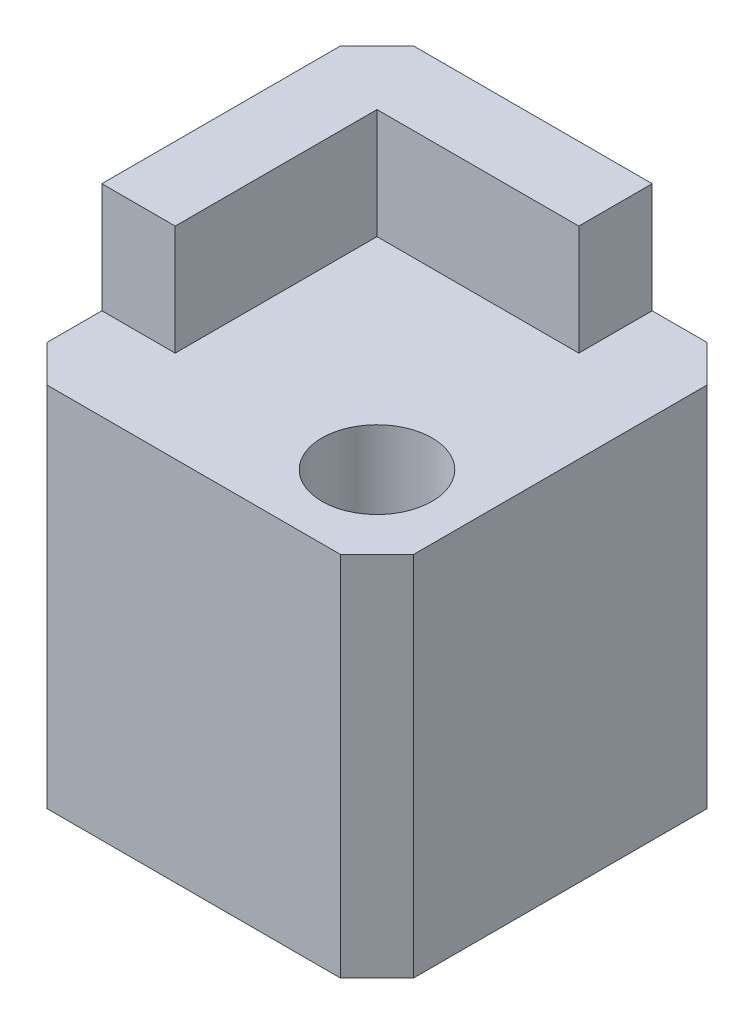
ISO-10303-21;
HEADER;
FILE_DESCRIPTION(('STEP AP214'),'2;1');
FILE_NAME('part.step','',(''),(''),'','','');
FILE_SCHEMA(('AUTOMOTIVE_DESIGN { 1 0 10303 214 1 1 1 1 }'));
ENDSEC;
DATA;
#1=APPLICATION_CONTEXT('core data for automotive mechanical design processes');
#2=APPLICATION_PROTOCOL_DEFINITION('international standard','automotive_design',2000,#1);
#3=PRODUCT_CONTEXT('',#1,'mechanical');
#4=PRODUCT('Part','Part','',(#3));
#5=PRODUCT_RELATED_PRODUCT_CATEGORY('part','',(#4));
#6=PRODUCT_DEFINITION_FORMATION('','',#4);
#7=PRODUCT_DEFINITION_CONTEXT('part definition',#1,'design');
#8=PRODUCT_DEFINITION('design','',#6,#7);
#9=PRODUCT_DEFINITION_SHAPE('','',#8);
#10=(LENGTH_UNIT() NAMED_UNIT(*) SI_UNIT(.MILLI.,.METRE.));
#11=(NAMED_UNIT(*) PLANE_ANGLE_UNIT() SI_UNIT($,.RADIAN.));
#12=(NAMED_UNIT(*) SI_UNIT($,.STERADIAN.) SOLID_ANGLE_UNIT());
#13=UNCERTAINTY_MEASURE_WITH_UNIT(LENGTH_MEASURE(1.E-05),#10,'distance_accuracy_value','');
#14=(GEOMETRIC_REPRESENTATION_CONTEXT(3) GLOBAL_UNCERTAINTY_ASSIGNED_CONTEXT((#13)) GLOBAL_UNIT_ASSIGNED_CONTEXT((#10,
#11,#12)) REPRESENTATION_CONTEXT('',''));
#15=CARTESIAN_POINT('',(0.,0.,0.));
#16=DIRECTION('',(0.,0.,1.));
#17=DIRECTION('',(1.,0.,0.));
#18=AXIS2_PLACEMENT_3D('',#15,#16,#17);
#19=CARTESIAN_POINT('',(0.,0.,0.));
#20=DIRECTION('',(0.,1.,0.));
#21=DIRECTION('',(0.,0.,1.));
#22=AXIS2_PLACEMENT_3D('',#19,#20,#21);
#23=PLANE('',#22);
#24=CARTESIAN_POINT('',(0.,0.,0.));
#25=DIRECTION('',(0.,1.,0.));
#26=DIRECTION('',(0.,0.,1.));
#27=AXIS2_PLACEMENT_3D('',#24,#25,#26);
#28=CIRCLE('',#27,1.5);
#29=CARTESIAN_POINT('',(0.,0.,1.5));
#30=VERTEX_POINT('',#29);
#31=EDGE_CURVE('E190',#30,#30,#28,.T.);
#32=ORIENTED_EDGE('',*,*,#31,.F.);
#33=EDGE_LOOP('',(#32));
#34=FACE_BOUND('',#33,.T.);
#35=DIRECTION('',(0.,0.,1.));
#36=VECTOR('',#35,1.);
#37=CARTESIAN_POINT('',(2.5,0.,-7.5));
#38=LINE('',#37,#36);
#39=CARTESIAN_POINT('',(2.5,0.,-6.5));
#40=VERTEX_POINT('',#39);
#41=CARTESIAN_POINT('',(2.5,0.,1.49999999999999));
#42=VERTEX_POINT('',#41);
#43=EDGE_CURVE('E250',#40,#42,#38,.T.);
#44=ORIENTED_EDGE('',*,*,#43,.F.);
#45=DIRECTION('',(0.707106781186549,0.,0.707106781186546));
#46=VECTOR('',#45,1.);
#47=CARTESIAN_POINT('',(4.5,0.,-4.50000000000001));
#48=LINE('',#47,#46);
#49=CARTESIAN_POINT('',(1.49999999999999,0.,-7.5));
#50=VERTEX_POINT('',#49);
#51=EDGE_CURVE('E293',#40,#50,#48,.F.);
#52=ORIENTED_EDGE('',*,*,#51,.T.);
#53=DIRECTION('',(1.,0.,0.));
#54=VECTOR('',#53,1.);
#55=CARTESIAN_POINT('',(-7.5,0.,-7.5));
#56=LINE('',#55,#54);
#57=CARTESIAN_POINT('',(0.,0.,-7.5));
#58=VERTEX_POINT('',#57);
#59=EDGE_CURVE('E232',#58,#50,#56,.T.);
#60=ORIENTED_EDGE('',*,*,#59,.F.);
#61=DIRECTION('',(0.,0.,1.));
#62=VECTOR('',#61,1.);
#63=CARTESIAN_POINT('',(0.,0.,0.));
#64=LINE('',#63,#62);
#65=CARTESIAN_POINT('',(0.,0.,-5.5));
#66=VERTEX_POINT('',#65);
#67=EDGE_CURVE('E170',#58,#66,#64,.T.);
#68=ORIENTED_EDGE('',*,*,#67,.T.);
#69=DIRECTION('',(-1.,0.,0.));
#70=VECTOR('',#69,1.);
#71=CARTESIAN_POINT('',(0.,0.,-5.5));
#72=LINE('',#71,#70);
#73=CARTESIAN_POINT('',(-5.5,0.,-5.5));
#74=VERTEX_POINT('',#73);
#75=EDGE_CURVE('E181',#66,#74,#72,.T.);
#76=ORIENTED_EDGE('',*,*,#75,.T.);
#77=DIRECTION('',(0.,0.,1.));
#78=VECTOR('',#77,1.);
#79=CARTESIAN_POINT('',(-5.5,0.,0.));
#80=LINE('',#79,#78);
#81=CARTESIAN_POINT('',(-5.5,0.,0.));
#82=VERTEX_POINT('',#81);
#83=EDGE_CURVE('E187',#74,#82,#80,.T.);
#84=ORIENTED_EDGE('',*,*,#83,.T.);
#85=DIRECTION('',(-1.,0.,0.));
#86=VECTOR('',#85,1.);
#87=CARTESIAN_POINT('',(0.,0.,0.));
#88=LINE('',#87,#86);
#89=CARTESIAN_POINT('',(-7.5,0.,0.));
#90=VERTEX_POINT('',#89);
#91=EDGE_CURVE('E209',#82,#90,#88,.T.);
#92=ORIENTED_EDGE('',*,*,#91,.T.);
#93=DIRECTION('',(0.,0.,1.));
#94=VECTOR('',#93,1.);
#95=CARTESIAN_POINT('',(-7.5,0.,-7.5));
#96=LINE('',#95,#94);
#97=CARTESIAN_POINT('',(-7.5,0.,1.5));
#98=VERTEX_POINT('',#97);
#99=EDGE_CURVE('E173',#90,#98,#96,.T.);
#100=ORIENTED_EDGE('',*,*,#99,.T.);
#101=DIRECTION('',(-0.707106781186549,0.,-0.707106781186546));
#102=VECTOR('',#101,1.);
#103=CARTESIAN_POINT('',(-4.49999999999998,0.,4.5));
#104=LINE('',#103,#102);
#105=CARTESIAN_POINT('',(-6.5,0.,2.5));
#106=VERTEX_POINT('',#105);
#107=EDGE_CURVE('E77',#98,#106,#104,.F.);
#108=ORIENTED_EDGE('',*,*,#107,.T.);
#109=DIRECTION('',(1.,0.,0.));
#110=VECTOR('',#109,1.);
#111=CARTESIAN_POINT('',(-7.5,0.,2.5));
#112=LINE('',#111,#110);
#113=CARTESIAN_POINT('',(1.5,0.,2.5));
#114=VERTEX_POINT('',#113);
#115=EDGE_CURVE('E247',#106,#114,#112,.T.);
#116=ORIENTED_EDGE('',*,*,#115,.T.);
#117=DIRECTION('',(0.707106781186546,0.,-0.707106781186549));
#118=VECTOR('',#117,1.);
#119=CARTESIAN_POINT('',(2.,0.,1.99999999999999));
#120=LINE('',#119,#118);
#121=EDGE_CURVE('E69',#114,#42,#120,.T.);
#122=ORIENTED_EDGE('',*,*,#121,.T.);
#123=EDGE_LOOP('',(#44,#52,#60,#68,#76,#84,#92,#100,#108,#116,#122));
#124=FACE_BOUND('',#123,.T.);
#125=ADVANCED_FACE('F52',(#34,#124),#23,.T.);
#126=CARTESIAN_POINT('',(-7.5,-10.,-7.5));
#127=DIRECTION('',(-1.,0.,0.));
#128=DIRECTION('',(0.,0.,1.));
#129=AXIS2_PLACEMENT_3D('',#126,#127,#128);
#130=PLANE('',#129);
#131=DIRECTION('',(0.,0.,-1.));
#132=VECTOR('',#131,1.);
#133=CARTESIAN_POINT('',(-7.5,3.,0.));
#134=LINE('',#133,#132);
#135=CARTESIAN_POINT('',(-7.5,3.,0.));
#136=VERTEX_POINT('',#135);
#137=CARTESIAN_POINT('',(-7.5,3.,-6.5));
#138=VERTEX_POINT('',#137);
#139=EDGE_CURVE('E162',#136,#138,#134,.T.);
#140=ORIENTED_EDGE('',*,*,#139,.T.);
#141=DIRECTION('',(0.,-1.,0.));
#142=VECTOR('',#141,1.);
#143=CARTESIAN_POINT('',(-7.5,-10.,-6.5));
#144=LINE('',#143,#142);
#145=CARTESIAN_POINT('',(-7.5,-10.,-6.5));
#146=VERTEX_POINT('',#145);
#147=EDGE_CURVE('E267',#138,#146,#144,.T.);
#148=ORIENTED_EDGE('',*,*,#147,.T.);
#149=DIRECTION('',(0.,0.,1.));
#150=VECTOR('',#149,1.);
#151=CARTESIAN_POINT('',(-7.5,-10.,-7.5));
#152=LINE('',#151,#150);
#153=CARTESIAN_POINT('',(-7.5,-10.,1.5));
#154=VERTEX_POINT('',#153);
#155=EDGE_CURVE('E227',#146,#154,#152,.T.);
#156=ORIENTED_EDGE('',*,*,#155,.T.);
#157=DIRECTION('',(0.,1.,0.));
#158=VECTOR('',#157,1.);
#159=CARTESIAN_POINT('',(-7.5,-10.,1.5));
#160=LINE('',#159,#158);
#161=EDGE_CURVE('E263',#154,#98,#160,.T.);
#162=ORIENTED_EDGE('',*,*,#161,.T.);
#163=ORIENTED_EDGE('',*,*,#99,.F.);
#164=DIRECTION('',(0.,-1.,0.));
#165=VECTOR('',#164,1.);
#166=CARTESIAN_POINT('',(-7.5,3.,0.));
#167=LINE('',#166,#165);
#168=EDGE_CURVE('E174',#136,#90,#167,.T.);
#169=ORIENTED_EDGE('',*,*,#168,.F.);
#170=EDGE_LOOP('',(#140,#148,#156,#162,#163,#169));
#171=FACE_BOUND('',#170,.T.);
#172=ADVANCED_FACE('F323',(#171),#130,.T.);
#173=CARTESIAN_POINT('',(-7.5,-10.,-7.5));
#174=DIRECTION('',(0.,0.,1.));
#175=DIRECTION('',(1.,0.,0.));
#176=AXIS2_PLACEMENT_3D('',#173,#174,#175);
#177=PLANE('',#176);
#178=DIRECTION('',(1.,0.,0.));
#179=VECTOR('',#178,1.);
#180=CARTESIAN_POINT('',(-7.5,-10.,-7.5));
#181=LINE('',#180,#179);
#182=CARTESIAN_POINT('',(-6.5,-10.,-7.5));
#183=VERTEX_POINT('',#182);
#184=CARTESIAN_POINT('',(1.49999999999999,-10.,-7.5));
#185=VERTEX_POINT('',#184);
#186=EDGE_CURVE('E240',#183,#185,#181,.T.);
#187=ORIENTED_EDGE('',*,*,#186,.F.);
#188=DIRECTION('',(0.,1.,0.));
#189=VECTOR('',#188,1.);
#190=CARTESIAN_POINT('',(-6.5,3.,-7.5));
#191=LINE('',#190,#189);
#192=CARTESIAN_POINT('',(-6.5,3.,-7.5));
#193=VERTEX_POINT('',#192);
#194=EDGE_CURVE('E158',#183,#193,#191,.T.);
#195=ORIENTED_EDGE('',*,*,#194,.T.);
#196=DIRECTION('',(1.,0.,0.));
#197=VECTOR('',#196,1.);
#198=CARTESIAN_POINT('',(0.,3.,-7.5));
#199=LINE('',#198,#197);
#200=CARTESIAN_POINT('',(0.,3.,-7.5));
#201=VERTEX_POINT('',#200);
#202=EDGE_CURVE('E150',#193,#201,#199,.T.);
#203=ORIENTED_EDGE('',*,*,#202,.T.);
#204=DIRECTION('',(0.,-1.,0.));
#205=VECTOR('',#204,1.);
#206=CARTESIAN_POINT('',(0.,3.,-7.5));
#207=LINE('',#206,#205);
#208=EDGE_CURVE('E155',#201,#58,#207,.T.);
#209=ORIENTED_EDGE('',*,*,#208,.T.);
#210=ORIENTED_EDGE('',*,*,#59,.T.);
#211=DIRECTION('',(0.,-1.,0.));
#212=VECTOR('',#211,1.);
#213=CARTESIAN_POINT('',(1.49999999999999,-10.,-7.5));
#214=LINE('',#213,#212);
#215=EDGE_CURVE('E244',#50,#185,#214,.T.);
#216=ORIENTED_EDGE('',*,*,#215,.T.);
#217=EDGE_LOOP('',(#187,#195,#203,#209,#210,#216));
#218=FACE_BOUND('',#217,.T.);
#219=ADVANCED_FACE('F153',(#218),#177,.F.);
#220=CARTESIAN_POINT('',(2.5,-10.,-7.5));
#221=DIRECTION('',(-1.,0.,0.));
#222=DIRECTION('',(0.,0.,1.));
#223=AXIS2_PLACEMENT_3D('',#220,#221,#222);
#224=PLANE('',#223);
#225=DIRECTION('',(0.,0.,1.));
#226=VECTOR('',#225,1.);
#227=CARTESIAN_POINT('',(2.5,-10.,-7.5));
#228=LINE('',#227,#226);
#229=CARTESIAN_POINT('',(2.5,-10.,-6.5));
#230=VERTEX_POINT('',#229);
#231=CARTESIAN_POINT('',(2.5,-10.,1.49999999999999));
#232=VERTEX_POINT('',#231);
#233=EDGE_CURVE('E236',#230,#232,#228,.T.);
#234=ORIENTED_EDGE('',*,*,#233,.F.);
#235=DIRECTION('',(0.,1.,0.));
#236=VECTOR('',#235,1.);
#237=CARTESIAN_POINT('',(2.5,-10.,-6.5));
#238=LINE('',#237,#236);
#239=EDGE_CURVE('E285',#230,#40,#238,.T.);
#240=ORIENTED_EDGE('',*,*,#239,.T.);
#241=ORIENTED_EDGE('',*,*,#43,.T.);
#242=DIRECTION('',(0.,-1.,0.));
#243=VECTOR('',#242,1.);
#244=CARTESIAN_POINT('',(2.5,-10.,1.49999999999999));
#245=LINE('',#244,#243);
#246=EDGE_CURVE('E282',#42,#232,#245,.T.);
#247=ORIENTED_EDGE('',*,*,#246,.T.);
#248=EDGE_LOOP('',(#234,#240,#241,#247));
#249=FACE_BOUND('',#248,.T.);
#250=ADVANCED_FACE('F306',(#249),#224,.F.);
#251=CARTESIAN_POINT('',(-7.5,-10.,2.5));
#252=DIRECTION('',(0.,0.,1.));
#253=DIRECTION('',(1.,0.,0.));
#254=AXIS2_PLACEMENT_3D('',#251,#252,#253);
#255=PLANE('',#254);
#256=ORIENTED_EDGE('',*,*,#115,.F.);
#257=DIRECTION('',(0.,-1.,0.));
#258=VECTOR('',#257,1.);
#259=CARTESIAN_POINT('',(-6.5,-10.,2.5));
#260=LINE('',#259,#258);
#261=CARTESIAN_POINT('',(-6.5,-10.,2.5));
#262=VERTEX_POINT('',#261);
#263=EDGE_CURVE('E11',#106,#262,#260,.T.);
#264=ORIENTED_EDGE('',*,*,#263,.T.);
#265=DIRECTION('',(1.,0.,0.));
#266=VECTOR('',#265,1.);
#267=CARTESIAN_POINT('',(-7.5,-10.,2.5));
#268=LINE('',#267,#266);
#269=CARTESIAN_POINT('',(1.5,-10.,2.5));
#270=VERTEX_POINT('',#269);
#271=EDGE_CURVE('E231',#262,#270,#268,.T.);
#272=ORIENTED_EDGE('',*,*,#271,.T.);
#273=DIRECTION('',(0.,1.,0.));
#274=VECTOR('',#273,1.);
#275=CARTESIAN_POINT('',(1.5,0.,2.5));
#276=LINE('',#275,#274);
#277=EDGE_CURVE('E62',#270,#114,#276,.T.);
#278=ORIENTED_EDGE('',*,*,#277,.T.);
#279=EDGE_LOOP('',(#256,#264,#272,#278));
#280=FACE_BOUND('',#279,.T.);
#281=ADVANCED_FACE('F299',(#280),#255,.T.);
#282=CARTESIAN_POINT('',(0.,-10.,0.));
#283=DIRECTION('',(0.,1.,0.));
#284=DIRECTION('',(0.,0.,1.));
#285=AXIS2_PLACEMENT_3D('',#282,#283,#284);
#286=PLANE('',#285);
#287=CARTESIAN_POINT('',(0.,-10.,0.));
#288=DIRECTION('',(0.,1.,0.));
#289=DIRECTION('',(0.,0.,1.));
#290=AXIS2_PLACEMENT_3D('',#287,#288,#289);
#291=CIRCLE('',#290,1.5);
#292=CARTESIAN_POINT('',(0.,-10.,1.5));
#293=VERTEX_POINT('',#292);
#294=EDGE_CURVE('E210',#293,#293,#291,.T.);
#295=ORIENTED_EDGE('',*,*,#294,.T.);
#296=EDGE_LOOP('',(#295));
#297=FACE_BOUND('',#296,.T.);
#298=ORIENTED_EDGE('',*,*,#155,.F.);
#299=DIRECTION('',(0.707106781186546,0.,-0.707106781186549));
#300=VECTOR('',#299,1.);
#301=CARTESIAN_POINT('',(-6.5,-10.,-7.5));
#302=LINE('',#301,#300);
#303=EDGE_CURVE('E279',#146,#183,#302,.T.);
#304=ORIENTED_EDGE('',*,*,#303,.T.);
#305=ORIENTED_EDGE('',*,*,#186,.T.);
#306=DIRECTION('',(-0.707106781186549,0.,-0.707106781186546));
#307=VECTOR('',#306,1.);
#308=CARTESIAN_POINT('',(2.5,-10.,-6.5));
#309=LINE('',#308,#307);
#310=EDGE_CURVE('E276',#185,#230,#309,.F.);
#311=ORIENTED_EDGE('',*,*,#310,.T.);
#312=ORIENTED_EDGE('',*,*,#233,.T.);
#313=DIRECTION('',(-0.707106781186546,0.,0.707106781186549));
#314=VECTOR('',#313,1.);
#315=CARTESIAN_POINT('',(1.5,-10.,2.5));
#316=LINE('',#315,#314);
#317=EDGE_CURVE('E270',#232,#270,#316,.T.);
#318=ORIENTED_EDGE('',*,*,#317,.T.);
#319=ORIENTED_EDGE('',*,*,#271,.F.);
#320=DIRECTION('',(0.707106781186549,0.,0.707106781186546));
#321=VECTOR('',#320,1.);
#322=CARTESIAN_POINT('',(-7.5,-10.,1.5));
#323=LINE('',#322,#321);
#324=EDGE_CURVE('E273',#262,#154,#323,.F.);
#325=ORIENTED_EDGE('',*,*,#324,.T.);
#326=EDGE_LOOP('',(#298,#304,#305,#311,#312,#318,#319,#325));
#327=FACE_BOUND('',#326,.T.);
#328=ADVANCED_FACE('F310',(#297,#327),#286,.F.);
#329=CARTESIAN_POINT('',(0.,3.,0.));
#330=DIRECTION('',(1.,0.,0.));
#331=DIRECTION('',(0.,0.,-1.));
#332=AXIS2_PLACEMENT_3D('',#329,#330,#331);
#333=PLANE('',#332);
#334=ORIENTED_EDGE('',*,*,#67,.F.);
#335=ORIENTED_EDGE('',*,*,#208,.F.);
#336=DIRECTION('',(0.,0.,1.));
#337=VECTOR('',#336,1.);
#338=CARTESIAN_POINT('',(0.,3.,0.));
#339=LINE('',#338,#337);
#340=CARTESIAN_POINT('',(0.,3.,-5.5));
#341=VERTEX_POINT('',#340);
#342=EDGE_CURVE('E163',#201,#341,#339,.T.);
#343=ORIENTED_EDGE('',*,*,#342,.T.);
#344=DIRECTION('',(0.,-1.,0.));
#345=VECTOR('',#344,1.);
#346=CARTESIAN_POINT('',(0.,3.,-5.5));
#347=LINE('',#346,#345);
#348=EDGE_CURVE('E206',#341,#66,#347,.T.);
#349=ORIENTED_EDGE('',*,*,#348,.T.);
#350=EDGE_LOOP('',(#334,#335,#343,#349));
#351=FACE_BOUND('',#350,.T.);
#352=ADVANCED_FACE('F167',(#351),#333,.T.);
#353=CARTESIAN_POINT('',(0.,3.,0.));
#354=DIRECTION('',(0.,0.,1.));
#355=DIRECTION('',(1.,0.,0.));
#356=AXIS2_PLACEMENT_3D('',#353,#354,#355);
#357=PLANE('',#356);
#358=ORIENTED_EDGE('',*,*,#91,.F.);
#359=DIRECTION('',(0.,-1.,0.));
#360=VECTOR('',#359,1.);
#361=CARTESIAN_POINT('',(-5.5,3.,0.));
#362=LINE('',#361,#360);
#363=CARTESIAN_POINT('',(-5.5,3.,0.));
#364=VERTEX_POINT('',#363);
#365=EDGE_CURVE('E222',#364,#82,#362,.T.);
#366=ORIENTED_EDGE('',*,*,#365,.F.);
#367=DIRECTION('',(-1.,0.,0.));
#368=VECTOR('',#367,1.);
#369=CARTESIAN_POINT('',(0.,3.,0.));
#370=LINE('',#369,#368);
#371=EDGE_CURVE('E196',#364,#136,#370,.T.);
#372=ORIENTED_EDGE('',*,*,#371,.T.);
#373=ORIENTED_EDGE('',*,*,#168,.T.);
#374=EDGE_LOOP('',(#358,#366,#372,#373));
#375=FACE_BOUND('',#374,.T.);
#376=ADVANCED_FACE('F327',(#375),#357,.T.);
#377=CARTESIAN_POINT('',(-5.5,3.,0.));
#378=DIRECTION('',(1.,0.,0.));
#379=DIRECTION('',(0.,0.,-1.));
#380=AXIS2_PLACEMENT_3D('',#377,#378,#379);
#381=PLANE('',#380);
#382=ORIENTED_EDGE('',*,*,#83,.F.);
#383=DIRECTION('',(0.,-1.,0.));
#384=VECTOR('',#383,1.);
#385=CARTESIAN_POINT('',(-5.5,3.,-5.5));
#386=LINE('',#385,#384);
#387=CARTESIAN_POINT('',(-5.5,3.,-5.5));
#388=VERTEX_POINT('',#387);
#389=EDGE_CURVE('E219',#388,#74,#386,.T.);
#390=ORIENTED_EDGE('',*,*,#389,.F.);
#391=DIRECTION('',(0.,0.,1.));
#392=VECTOR('',#391,1.);
#393=CARTESIAN_POINT('',(-5.5,3.,0.));
#394=LINE('',#393,#392);
#395=EDGE_CURVE('E200',#388,#364,#394,.T.);
#396=ORIENTED_EDGE('',*,*,#395,.T.);
#397=ORIENTED_EDGE('',*,*,#365,.T.);
#398=EDGE_LOOP('',(#382,#390,#396,#397));
#399=FACE_BOUND('',#398,.T.);
#400=ADVANCED_FACE('F331',(#399),#381,.T.);
#401=CARTESIAN_POINT('',(0.,3.,-5.5));
#402=DIRECTION('',(0.,0.,1.));
#403=DIRECTION('',(1.,0.,0.));
#404=AXIS2_PLACEMENT_3D('',#401,#402,#403);
#405=PLANE('',#404);
#406=ORIENTED_EDGE('',*,*,#75,.F.);
#407=ORIENTED_EDGE('',*,*,#348,.F.);
#408=DIRECTION('',(-1.,0.,0.));
#409=VECTOR('',#408,1.);
#410=CARTESIAN_POINT('',(0.,3.,-5.5));
#411=LINE('',#410,#409);
#412=EDGE_CURVE('E179',#341,#388,#411,.T.);
#413=ORIENTED_EDGE('',*,*,#412,.T.);
#414=ORIENTED_EDGE('',*,*,#389,.T.);
#415=EDGE_LOOP('',(#406,#407,#413,#414));
#416=FACE_BOUND('',#415,.T.);
#417=ADVANCED_FACE('F333',(#416),#405,.T.);
#418=CARTESIAN_POINT('',(0.,3.,0.));
#419=DIRECTION('',(0.,1.,0.));
#420=DIRECTION('',(0.,0.,1.));
#421=AXIS2_PLACEMENT_3D('',#418,#419,#420);
#422=PLANE('',#421);
#423=ORIENTED_EDGE('',*,*,#202,.F.);
#424=DIRECTION('',(-0.707106781186546,0.,0.707106781186549));
#425=VECTOR('',#424,1.);
#426=CARTESIAN_POINT('',(-7.00000000000002,3.,-6.99999999999998));
#427=LINE('',#426,#425);
#428=EDGE_CURVE('E260',#193,#138,#427,.T.);
#429=ORIENTED_EDGE('',*,*,#428,.T.);
#430=ORIENTED_EDGE('',*,*,#139,.F.);
#431=ORIENTED_EDGE('',*,*,#371,.F.);
#432=ORIENTED_EDGE('',*,*,#395,.F.);
#433=ORIENTED_EDGE('',*,*,#412,.F.);
#434=ORIENTED_EDGE('',*,*,#342,.F.);
#435=EDGE_LOOP('',(#423,#429,#430,#431,#432,#433,#434));
#436=FACE_BOUND('',#435,.T.);
#437=ADVANCED_FACE('F176',(#436),#422,.T.);
#438=CARTESIAN_POINT('',(-6.5,-10.,-7.5));
#439=DIRECTION('',(-0.707106781186549,0.,-0.707106781186546));
#440=DIRECTION('',(0.,-1.,0.));
#441=AXIS2_PLACEMENT_3D('',#438,#439,#440);
#442=PLANE('',#441);
#443=ORIENTED_EDGE('',*,*,#303,.F.);
#444=ORIENTED_EDGE('',*,*,#147,.F.);
#445=ORIENTED_EDGE('',*,*,#428,.F.);
#446=ORIENTED_EDGE('',*,*,#194,.F.);
#447=EDGE_LOOP('',(#443,#444,#445,#446));
#448=FACE_BOUND('',#447,.T.);
#449=ADVANCED_FACE('F319',(#448),#442,.T.);
#450=CARTESIAN_POINT('',(2.5,-10.,-6.5));
#451=DIRECTION('',(-0.707106781186546,0.,0.707106781186549));
#452=DIRECTION('',(0.,1.,0.));
#453=AXIS2_PLACEMENT_3D('',#450,#451,#452);
#454=PLANE('',#453);
#455=ORIENTED_EDGE('',*,*,#310,.F.);
#456=ORIENTED_EDGE('',*,*,#215,.F.);
#457=ORIENTED_EDGE('',*,*,#51,.F.);
#458=ORIENTED_EDGE('',*,*,#239,.F.);
#459=EDGE_LOOP('',(#455,#456,#457,#458));
#460=FACE_BOUND('',#459,.T.);
#461=ADVANCED_FACE('F314',(#460),#454,.F.);
#462=CARTESIAN_POINT('',(-7.5,-10.,1.5));
#463=DIRECTION('',(0.707106781186546,0.,-0.707106781186549));
#464=DIRECTION('',(0.,1.,0.));
#465=AXIS2_PLACEMENT_3D('',#462,#463,#464);
#466=PLANE('',#465);
#467=ORIENTED_EDGE('',*,*,#324,.F.);
#468=ORIENTED_EDGE('',*,*,#263,.F.);
#469=ORIENTED_EDGE('',*,*,#107,.F.);
#470=ORIENTED_EDGE('',*,*,#161,.F.);
#471=EDGE_LOOP('',(#467,#468,#469,#470));
#472=FACE_BOUND('',#471,.T.);
#473=ADVANCED_FACE('F369',(#472),#466,.F.);
#474=CARTESIAN_POINT('',(1.5,-10.,2.5));
#475=DIRECTION('',(0.707106781186549,0.,0.707106781186546));
#476=DIRECTION('',(0.,-1.,0.));
#477=AXIS2_PLACEMENT_3D('',#474,#475,#476);
#478=PLANE('',#477);
#479=ORIENTED_EDGE('',*,*,#317,.F.);
#480=ORIENTED_EDGE('',*,*,#246,.F.);
#481=ORIENTED_EDGE('',*,*,#121,.F.);
#482=ORIENTED_EDGE('',*,*,#277,.F.);
#483=EDGE_LOOP('',(#479,#480,#481,#482));
#484=FACE_BOUND('',#483,.T.);
#485=ADVANCED_FACE('F55',(#484),#478,.T.);
#486=CARTESIAN_POINT('',(0.,-10.,0.));
#487=DIRECTION('',(0.,1.,0.));
#488=DIRECTION('',(0.,0.,1.));
#489=AXIS2_PLACEMENT_3D('',#486,#487,#488);
#490=CYLINDRICAL_SURFACE('',#489,1.5);
#491=ORIENTED_EDGE('',*,*,#294,.F.);
#492=EDGE_LOOP('',(#491));
#493=FACE_BOUND('',#492,.T.);
#494=ORIENTED_EDGE('',*,*,#31,.T.);
#495=EDGE_LOOP('',(#494));
#496=FACE_BOUND('',#495,.T.);
#497=ADVANCED_FACE('F377',(#493,#496),#490,.F.);
#498=CLOSED_SHELL('',(#125,#172,#219,#250,#281,#328,#352,#376,#400,#417,#437,#449,#461,#473,
#485,#497));
#499=MANIFOLD_SOLID_BREP('B2',#498);
#500=ADVANCED_BREP_SHAPE_REPRESENTATION('',(#18,#499),#14);
#501=SHAPE_DEFINITION_REPRESENTATION(#9,#500);
ENDSEC;
END-ISO-10303-21;
